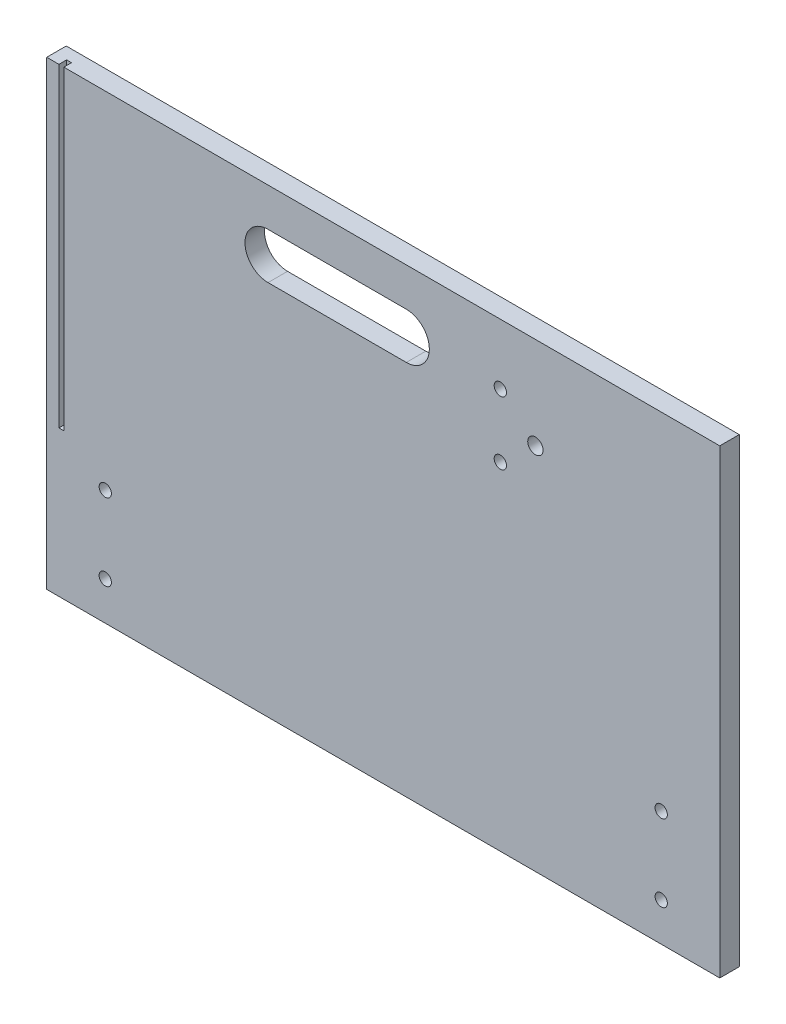
ISO-10303-21;
HEADER;
FILE_DESCRIPTION(('STEP AP214'),'2;1');
FILE_NAME('part.step','',(''),(''),'','','');
FILE_SCHEMA(('AUTOMOTIVE_DESIGN { 1 0 10303 214 1 1 1 1 }'));
ENDSEC;
DATA;
#1=APPLICATION_CONTEXT('core data for automotive mechanical design processes');
#2=APPLICATION_PROTOCOL_DEFINITION('international standard','automotive_design',2000,#1);
#3=PRODUCT_CONTEXT('',#1,'mechanical');
#4=PRODUCT('Part','Part','',(#3));
#5=PRODUCT_RELATED_PRODUCT_CATEGORY('part','',(#4));
#6=PRODUCT_DEFINITION_FORMATION('','',#4);
#7=PRODUCT_DEFINITION_CONTEXT('part definition',#1,'design');
#8=PRODUCT_DEFINITION('design','',#6,#7);
#9=PRODUCT_DEFINITION_SHAPE('','',#8);
#10=(LENGTH_UNIT() NAMED_UNIT(*) SI_UNIT(.MILLI.,.METRE.));
#11=(NAMED_UNIT(*) PLANE_ANGLE_UNIT() SI_UNIT($,.RADIAN.));
#12=(NAMED_UNIT(*) SI_UNIT($,.STERADIAN.) SOLID_ANGLE_UNIT());
#13=UNCERTAINTY_MEASURE_WITH_UNIT(LENGTH_MEASURE(1.E-05),#10,'distance_accuracy_value','');
#14=(GEOMETRIC_REPRESENTATION_CONTEXT(3) GLOBAL_UNCERTAINTY_ASSIGNED_CONTEXT((#13)) GLOBAL_UNIT_ASSIGNED_CONTEXT((#10,
#11,#12)) REPRESENTATION_CONTEXT('',''));
#15=CARTESIAN_POINT('',(0.,0.,0.));
#16=DIRECTION('',(0.,0.,1.));
#17=DIRECTION('',(1.,0.,0.));
#18=AXIS2_PLACEMENT_3D('',#15,#16,#17);
#19=CARTESIAN_POINT('',(0.,0.,12.7));
#20=DIRECTION('',(0.,0.,1.));
#21=DIRECTION('',(1.,0.,0.));
#22=AXIS2_PLACEMENT_3D('',#19,#20,#21);
#23=PLANE('',#22);
#24=CARTESIAN_POINT('',(15.,110.,12.7));
#25=DIRECTION('',(0.,0.,1.));
#26=DIRECTION('',(1.,0.,0.));
#27=AXIS2_PLACEMENT_3D('',#24,#25,#26);
#28=CIRCLE('',#27,15.);
#29=CARTESIAN_POINT('',(15.,95.,12.7));
#30=VERTEX_POINT('',#29);
#31=CARTESIAN_POINT('',(15.,125.,12.7));
#32=VERTEX_POINT('',#31);
#33=EDGE_CURVE('E49',#30,#32,#28,.T.);
#34=ORIENTED_EDGE('',*,*,#33,.F.);
#35=DIRECTION('',(1.,0.,0.));
#36=VECTOR('',#35,1.);
#37=CARTESIAN_POINT('',(15.,95.,12.7));
#38=LINE('',#37,#36);
#39=CARTESIAN_POINT('',(-75.,95.,12.7));
#40=VERTEX_POINT('',#39);
#41=EDGE_CURVE('E130',#40,#30,#38,.T.);
#42=ORIENTED_EDGE('',*,*,#41,.F.);
#43=CARTESIAN_POINT('',(-75.,110.,12.7));
#44=DIRECTION('',(0.,0.,1.));
#45=DIRECTION('',(1.,0.,0.));
#46=AXIS2_PLACEMENT_3D('',#43,#44,#45);
#47=CIRCLE('',#46,15.);
#48=CARTESIAN_POINT('',(-75.,125.,12.7));
#49=VERTEX_POINT('',#48);
#50=EDGE_CURVE('E150',#49,#40,#47,.T.);
#51=ORIENTED_EDGE('',*,*,#50,.F.);
#52=DIRECTION('',(-1.,0.,0.));
#53=VECTOR('',#52,1.);
#54=CARTESIAN_POINT('',(15.,125.,12.7));
#55=LINE('',#54,#53);
#56=EDGE_CURVE('E144',#32,#49,#55,.T.);
#57=ORIENTED_EDGE('',*,*,#56,.F.);
#58=EDGE_LOOP('',(#34,#42,#51,#57));
#59=FACE_BOUND('',#58,.T.);
#60=CARTESIAN_POINT('',(180.95,-75.,12.7));
#61=DIRECTION('',(0.,0.,1.));
#62=DIRECTION('',(-1.,0.,0.));
#63=AXIS2_PLACEMENT_3D('',#60,#61,#62);
#64=CIRCLE('',#63,3.99999999999999);
#65=CARTESIAN_POINT('',(176.95,-75.,12.7));
#66=VERTEX_POINT('',#65);
#67=EDGE_CURVE('E136',#66,#66,#64,.T.);
#68=ORIENTED_EDGE('',*,*,#67,.F.);
#69=EDGE_LOOP('',(#68));
#70=FACE_BOUND('',#69,.T.);
#71=CARTESIAN_POINT('',(180.95,-125.,12.7));
#72=DIRECTION('',(0.,0.,1.));
#73=DIRECTION('',(1.,0.,0.));
#74=AXIS2_PLACEMENT_3D('',#71,#72,#73);
#75=CIRCLE('',#74,3.99999999999999);
#76=CARTESIAN_POINT('',(184.95,-125.,12.7));
#77=VERTEX_POINT('',#76);
#78=EDGE_CURVE('E164',#77,#77,#75,.T.);
#79=ORIENTED_EDGE('',*,*,#78,.F.);
#80=EDGE_LOOP('',(#79));
#81=FACE_BOUND('',#80,.T.);
#82=CARTESIAN_POINT('',(-180.95,-125.,12.7));
#83=DIRECTION('',(0.,0.,1.));
#84=DIRECTION('',(-1.,0.,0.));
#85=AXIS2_PLACEMENT_3D('',#82,#83,#84);
#86=CIRCLE('',#85,3.99999999999999);
#87=CARTESIAN_POINT('',(-184.95,-125.,12.7));
#88=VERTEX_POINT('',#87);
#89=EDGE_CURVE('E170',#88,#88,#86,.T.);
#90=ORIENTED_EDGE('',*,*,#89,.F.);
#91=EDGE_LOOP('',(#90));
#92=FACE_BOUND('',#91,.T.);
#93=CARTESIAN_POINT('',(-180.95,-75.,12.7));
#94=DIRECTION('',(0.,0.,1.));
#95=DIRECTION('',(1.,0.,0.));
#96=AXIS2_PLACEMENT_3D('',#93,#94,#95);
#97=CIRCLE('',#96,3.99999999999999);
#98=CARTESIAN_POINT('',(-176.95,-75.,12.7));
#99=VERTEX_POINT('',#98);
#100=EDGE_CURVE('E176',#99,#99,#97,.T.);
#101=ORIENTED_EDGE('',*,*,#100,.F.);
#102=EDGE_LOOP('',(#101));
#103=FACE_BOUND('',#102,.T.);
#104=DIRECTION('',(0.,-1.,0.));
#105=VECTOR('',#104,1.);
#106=CARTESIAN_POINT('',(-211.1125,150.,12.7));
#107=LINE('',#106,#105);
#108=CARTESIAN_POINT('',(-211.1125,150.,12.7));
#109=VERTEX_POINT('',#108);
#110=CARTESIAN_POINT('',(-211.1125,-55.,12.7));
#111=VERTEX_POINT('',#110);
#112=EDGE_CURVE('E182',#109,#111,#107,.T.);
#113=ORIENTED_EDGE('',*,*,#112,.F.);
#114=DIRECTION('',(-1.,0.,0.));
#115=VECTOR('',#114,1.);
#116=CARTESIAN_POINT('',(0.,150.,12.7));
#117=LINE('',#116,#115);
#118=CARTESIAN_POINT('',(-219.05,150.,12.7));
#119=VERTEX_POINT('',#118);
#120=EDGE_CURVE('E232',#109,#119,#117,.T.);
#121=ORIENTED_EDGE('',*,*,#120,.T.);
#122=DIRECTION('',(0.,-1.,0.));
#123=VECTOR('',#122,1.);
#124=CARTESIAN_POINT('',(-219.05,0.,12.7));
#125=LINE('',#124,#123);
#126=CARTESIAN_POINT('',(-219.05,-150.,12.7));
#127=VERTEX_POINT('',#126);
#128=EDGE_CURVE('E237',#119,#127,#125,.T.);
#129=ORIENTED_EDGE('',*,*,#128,.T.);
#130=DIRECTION('',(-1.,0.,0.));
#131=VECTOR('',#130,1.);
#132=CARTESIAN_POINT('',(0.,-150.,12.7));
#133=LINE('',#132,#131);
#134=CARTESIAN_POINT('',(219.05,-150.,12.7));
#135=VERTEX_POINT('',#134);
#136=EDGE_CURVE('E239',#135,#127,#133,.T.);
#137=ORIENTED_EDGE('',*,*,#136,.F.);
#138=DIRECTION('',(0.,-1.,0.));
#139=VECTOR('',#138,1.);
#140=CARTESIAN_POINT('',(219.05,0.,12.7));
#141=LINE('',#140,#139);
#142=CARTESIAN_POINT('',(219.05,150.,12.7));
#143=VERTEX_POINT('',#142);
#144=EDGE_CURVE('E229',#143,#135,#141,.T.);
#145=ORIENTED_EDGE('',*,*,#144,.F.);
#146=CARTESIAN_POINT('',(-207.9375,150.,12.7));
#147=VERTEX_POINT('',#146);
#148=EDGE_CURVE('E234',#143,#147,#117,.T.);
#149=ORIENTED_EDGE('',*,*,#148,.T.);
#150=DIRECTION('',(0.,1.,0.));
#151=VECTOR('',#150,1.);
#152=CARTESIAN_POINT('',(-207.9375,150.,12.7));
#153=LINE('',#152,#151);
#154=CARTESIAN_POINT('',(-207.9375,-55.,12.7));
#155=VERTEX_POINT('',#154);
#156=EDGE_CURVE('E187',#155,#147,#153,.T.);
#157=ORIENTED_EDGE('',*,*,#156,.F.);
#158=DIRECTION('',(1.,0.,0.));
#159=VECTOR('',#158,1.);
#160=CARTESIAN_POINT('',(-211.1125,-55.,12.7));
#161=LINE('',#160,#159);
#162=EDGE_CURVE('E198',#111,#155,#161,.T.);
#163=ORIENTED_EDGE('',*,*,#162,.F.);
#164=EDGE_LOOP('',(#113,#121,#129,#137,#145,#149,#157,#163));
#165=FACE_BOUND('',#164,.T.);
#166=CARTESIAN_POINT('',(99.0500000000001,90.0000000001999,12.7));
#167=DIRECTION('',(0.,0.,1.));
#168=DIRECTION('',(1.,0.,0.));
#169=AXIS2_PLACEMENT_3D('',#166,#167,#168);
#170=CIRCLE('',#169,5.00000000000001);
#171=CARTESIAN_POINT('',(104.05,90.0000000001999,12.7));
#172=VERTEX_POINT('',#171);
#173=EDGE_CURVE('E204',#172,#172,#170,.T.);
#174=ORIENTED_EDGE('',*,*,#173,.F.);
#175=EDGE_LOOP('',(#174));
#176=FACE_BOUND('',#175,.T.);
#177=CARTESIAN_POINT('',(76.2148703851,110.5900655849,12.7));
#178=DIRECTION('',(0.,0.,1.));
#179=DIRECTION('',(1.,0.,0.));
#180=AXIS2_PLACEMENT_3D('',#177,#178,#179);
#181=CIRCLE('',#180,4.0000000001913);
#182=CARTESIAN_POINT('',(80.2148703852913,110.5900655849,12.7));
#183=VERTEX_POINT('',#182);
#184=EDGE_CURVE('E216',#183,#183,#181,.T.);
#185=ORIENTED_EDGE('',*,*,#184,.F.);
#186=EDGE_LOOP('',(#185));
#187=FACE_BOUND('',#186,.T.);
#188=CARTESIAN_POINT('',(76.2148703851002,69.4099344154998,12.7));
#189=DIRECTION('',(0.,0.,1.));
#190=DIRECTION('',(1.,0.,0.));
#191=AXIS2_PLACEMENT_3D('',#188,#189,#190);
#192=CIRCLE('',#191,4.00000000019125);
#193=CARTESIAN_POINT('',(80.2148703852914,69.4099344154998,12.7));
#194=VERTEX_POINT('',#193);
#195=EDGE_CURVE('E223',#194,#194,#192,.F.);
#196=ORIENTED_EDGE('',*,*,#195,.T.);
#197=EDGE_LOOP('',(#196));
#198=FACE_BOUND('',#197,.T.);
#199=ADVANCED_FACE('F34',(#59,#70,#81,#92,#103,#165,#176,#187,#198),#23,.T.);
#200=CARTESIAN_POINT('',(0.,0.,0.));
#201=DIRECTION('',(0.,0.,1.));
#202=DIRECTION('',(1.,0.,0.));
#203=AXIS2_PLACEMENT_3D('',#200,#201,#202);
#204=PLANE('',#203);
#205=DIRECTION('',(-1.,0.,0.));
#206=VECTOR('',#205,1.);
#207=CARTESIAN_POINT('',(15.,95.,0.));
#208=LINE('',#207,#206);
#209=CARTESIAN_POINT('',(15.,95.,0.));
#210=VERTEX_POINT('',#209);
#211=CARTESIAN_POINT('',(-75.,95.,0.));
#212=VERTEX_POINT('',#211);
#213=EDGE_CURVE('E142',#210,#212,#208,.T.);
#214=ORIENTED_EDGE('',*,*,#213,.F.);
#215=CARTESIAN_POINT('',(15.,110.,0.));
#216=DIRECTION('',(0.,0.,1.));
#217=DIRECTION('',(1.,0.,0.));
#218=AXIS2_PLACEMENT_3D('',#215,#216,#217);
#219=CIRCLE('',#218,15.);
#220=CARTESIAN_POINT('',(15.,125.,0.));
#221=VERTEX_POINT('',#220);
#222=EDGE_CURVE('E124',#221,#210,#219,.F.);
#223=ORIENTED_EDGE('',*,*,#222,.F.);
#224=DIRECTION('',(1.,0.,0.));
#225=VECTOR('',#224,1.);
#226=CARTESIAN_POINT('',(15.,125.,0.));
#227=LINE('',#226,#225);
#228=CARTESIAN_POINT('',(-75.,125.,0.));
#229=VERTEX_POINT('',#228);
#230=EDGE_CURVE('E133',#229,#221,#227,.T.);
#231=ORIENTED_EDGE('',*,*,#230,.F.);
#232=CARTESIAN_POINT('',(-75.,110.,0.));
#233=DIRECTION('',(0.,0.,1.));
#234=DIRECTION('',(1.,0.,0.));
#235=AXIS2_PLACEMENT_3D('',#232,#233,#234);
#236=CIRCLE('',#235,15.);
#237=EDGE_CURVE('E57',#212,#229,#236,.F.);
#238=ORIENTED_EDGE('',*,*,#237,.F.);
#239=EDGE_LOOP('',(#214,#223,#231,#238));
#240=FACE_BOUND('',#239,.T.);
#241=CARTESIAN_POINT('',(180.95,-75.,0.));
#242=DIRECTION('',(0.,0.,1.));
#243=DIRECTION('',(1.,0.,0.));
#244=AXIS2_PLACEMENT_3D('',#241,#242,#243);
#245=CIRCLE('',#244,3.99999999999999);
#246=CARTESIAN_POINT('',(184.95,-75.,0.));
#247=VERTEX_POINT('',#246);
#248=EDGE_CURVE('E161',#247,#247,#245,.F.);
#249=ORIENTED_EDGE('',*,*,#248,.F.);
#250=EDGE_LOOP('',(#249));
#251=FACE_BOUND('',#250,.T.);
#252=CARTESIAN_POINT('',(180.95,-125.,0.));
#253=DIRECTION('',(0.,0.,1.));
#254=DIRECTION('',(1.,0.,0.));
#255=AXIS2_PLACEMENT_3D('',#252,#253,#254);
#256=CIRCLE('',#255,3.99999999999999);
#257=CARTESIAN_POINT('',(184.95,-125.,0.));
#258=VERTEX_POINT('',#257);
#259=EDGE_CURVE('E167',#258,#258,#256,.F.);
#260=ORIENTED_EDGE('',*,*,#259,.F.);
#261=EDGE_LOOP('',(#260));
#262=FACE_BOUND('',#261,.T.);
#263=CARTESIAN_POINT('',(-180.95,-125.,0.));
#264=DIRECTION('',(0.,0.,1.));
#265=DIRECTION('',(1.,0.,0.));
#266=AXIS2_PLACEMENT_3D('',#263,#264,#265);
#267=CIRCLE('',#266,3.99999999999999);
#268=CARTESIAN_POINT('',(-176.95,-125.,0.));
#269=VERTEX_POINT('',#268);
#270=EDGE_CURVE('E173',#269,#269,#267,.F.);
#271=ORIENTED_EDGE('',*,*,#270,.F.);
#272=EDGE_LOOP('',(#271));
#273=FACE_BOUND('',#272,.T.);
#274=CARTESIAN_POINT('',(-180.95,-75.,0.));
#275=DIRECTION('',(0.,0.,1.));
#276=DIRECTION('',(1.,0.,0.));
#277=AXIS2_PLACEMENT_3D('',#274,#275,#276);
#278=CIRCLE('',#277,3.99999999999999);
#279=CARTESIAN_POINT('',(-176.95,-75.,0.));
#280=VERTEX_POINT('',#279);
#281=EDGE_CURVE('E179',#280,#280,#278,.F.);
#282=ORIENTED_EDGE('',*,*,#281,.F.);
#283=EDGE_LOOP('',(#282));
#284=FACE_BOUND('',#283,.T.);
#285=CARTESIAN_POINT('',(99.0500000000001,90.0000000001999,0.));
#286=DIRECTION('',(0.,0.,1.));
#287=DIRECTION('',(1.,0.,0.));
#288=AXIS2_PLACEMENT_3D('',#285,#286,#287);
#289=CIRCLE('',#288,5.00000000000001);
#290=CARTESIAN_POINT('',(104.05,90.0000000001999,0.));
#291=VERTEX_POINT('',#290);
#292=EDGE_CURVE('E213',#291,#291,#289,.F.);
#293=ORIENTED_EDGE('',*,*,#292,.F.);
#294=EDGE_LOOP('',(#293));
#295=FACE_BOUND('',#294,.T.);
#296=CARTESIAN_POINT('',(76.2148703851,110.5900655849,0.));
#297=DIRECTION('',(0.,0.,1.));
#298=DIRECTION('',(1.,0.,0.));
#299=AXIS2_PLACEMENT_3D('',#296,#297,#298);
#300=CIRCLE('',#299,4.0000000001913);
#301=CARTESIAN_POINT('',(80.2148703852913,110.5900655849,0.));
#302=VERTEX_POINT('',#301);
#303=EDGE_CURVE('E219',#302,#302,#300,.F.);
#304=ORIENTED_EDGE('',*,*,#303,.F.);
#305=EDGE_LOOP('',(#304));
#306=FACE_BOUND('',#305,.T.);
#307=DIRECTION('',(0.,-1.,0.));
#308=VECTOR('',#307,1.);
#309=CARTESIAN_POINT('',(219.05,0.,0.));
#310=LINE('',#309,#308);
#311=CARTESIAN_POINT('',(219.05,150.,0.));
#312=VERTEX_POINT('',#311);
#313=CARTESIAN_POINT('',(219.05,-150.,0.));
#314=VERTEX_POINT('',#313);
#315=EDGE_CURVE('E226',#312,#314,#310,.T.);
#316=ORIENTED_EDGE('',*,*,#315,.T.);
#317=DIRECTION('',(-1.,0.,0.));
#318=VECTOR('',#317,1.);
#319=CARTESIAN_POINT('',(0.,-150.,0.));
#320=LINE('',#319,#318);
#321=CARTESIAN_POINT('',(-219.05,-150.,0.));
#322=VERTEX_POINT('',#321);
#323=EDGE_CURVE('E233',#314,#322,#320,.T.);
#324=ORIENTED_EDGE('',*,*,#323,.T.);
#325=DIRECTION('',(0.,-1.,0.));
#326=VECTOR('',#325,1.);
#327=CARTESIAN_POINT('',(-219.05,0.,0.));
#328=LINE('',#327,#326);
#329=CARTESIAN_POINT('',(-219.05,150.,0.));
#330=VERTEX_POINT('',#329);
#331=EDGE_CURVE('E247',#330,#322,#328,.T.);
#332=ORIENTED_EDGE('',*,*,#331,.F.);
#333=DIRECTION('',(-1.,0.,0.));
#334=VECTOR('',#333,1.);
#335=CARTESIAN_POINT('',(0.,150.,0.));
#336=LINE('',#335,#334);
#337=EDGE_CURVE('E245',#312,#330,#336,.T.);
#338=ORIENTED_EDGE('',*,*,#337,.F.);
#339=EDGE_LOOP('',(#316,#324,#332,#338));
#340=FACE_BOUND('',#339,.T.);
#341=CARTESIAN_POINT('',(76.2148703851002,69.4099344154998,0.));
#342=DIRECTION('',(0.,0.,1.));
#343=DIRECTION('',(1.,0.,0.));
#344=AXIS2_PLACEMENT_3D('',#341,#342,#343);
#345=CIRCLE('',#344,4.00000000019125);
#346=CARTESIAN_POINT('',(80.2148703852914,69.4099344154998,0.));
#347=VERTEX_POINT('',#346);
#348=EDGE_CURVE('E222',#347,#347,#345,.T.);
#349=ORIENTED_EDGE('',*,*,#348,.T.);
#350=EDGE_LOOP('',(#349));
#351=FACE_BOUND('',#350,.T.);
#352=ADVANCED_FACE('F139',(#240,#251,#262,#273,#284,#295,#306,#340,#351),#204,.F.);
#353=CARTESIAN_POINT('',(219.05,0.,12.7));
#354=DIRECTION('',(1.,0.,0.));
#355=DIRECTION('',(0.,0.,-1.));
#356=AXIS2_PLACEMENT_3D('',#353,#354,#355);
#357=PLANE('',#356);
#358=ORIENTED_EDGE('',*,*,#315,.F.);
#359=DIRECTION('',(0.,0.,-1.));
#360=VECTOR('',#359,1.);
#361=CARTESIAN_POINT('',(219.05,150.,12.7));
#362=LINE('',#361,#360);
#363=EDGE_CURVE('E11',#143,#312,#362,.T.);
#364=ORIENTED_EDGE('',*,*,#363,.F.);
#365=ORIENTED_EDGE('',*,*,#144,.T.);
#366=DIRECTION('',(0.,0.,-1.));
#367=VECTOR('',#366,1.);
#368=CARTESIAN_POINT('',(219.05,-150.,12.7));
#369=LINE('',#368,#367);
#370=EDGE_CURVE('E242',#135,#314,#369,.T.);
#371=ORIENTED_EDGE('',*,*,#370,.T.);
#372=EDGE_LOOP('',(#358,#364,#365,#371));
#373=FACE_BOUND('',#372,.T.);
#374=ADVANCED_FACE('F36',(#373),#357,.T.);
#375=CARTESIAN_POINT('',(0.,150.,12.7));
#376=DIRECTION('',(0.,-1.,0.));
#377=DIRECTION('',(1.,0.,0.));
#378=AXIS2_PLACEMENT_3D('',#375,#376,#377);
#379=PLANE('',#378);
#380=ORIENTED_EDGE('',*,*,#120,.F.);
#381=DIRECTION('',(0.,0.,1.));
#382=VECTOR('',#381,1.);
#383=CARTESIAN_POINT('',(-211.1125,150.,7.7));
#384=LINE('',#383,#382);
#385=CARTESIAN_POINT('',(-211.1125,150.,7.7));
#386=VERTEX_POINT('',#385);
#387=EDGE_CURVE('E202',#386,#109,#384,.T.);
#388=ORIENTED_EDGE('',*,*,#387,.F.);
#389=DIRECTION('',(-1.,0.,0.));
#390=VECTOR('',#389,1.);
#391=CARTESIAN_POINT('',(-211.1125,150.,7.7));
#392=LINE('',#391,#390);
#393=CARTESIAN_POINT('',(-207.9375,150.,7.7));
#394=VERTEX_POINT('',#393);
#395=EDGE_CURVE('E192',#394,#386,#392,.T.);
#396=ORIENTED_EDGE('',*,*,#395,.F.);
#397=DIRECTION('',(0.,0.,1.));
#398=VECTOR('',#397,1.);
#399=CARTESIAN_POINT('',(-207.9375,150.,7.7));
#400=LINE('',#399,#398);
#401=EDGE_CURVE('E205',#394,#147,#400,.T.);
#402=ORIENTED_EDGE('',*,*,#401,.T.);
#403=ORIENTED_EDGE('',*,*,#148,.F.);
#404=ORIENTED_EDGE('',*,*,#363,.T.);
#405=ORIENTED_EDGE('',*,*,#337,.T.);
#406=DIRECTION('',(0.,0.,-1.));
#407=VECTOR('',#406,1.);
#408=CARTESIAN_POINT('',(-219.05,150.,12.7));
#409=LINE('',#408,#407);
#410=EDGE_CURVE('E42',#119,#330,#409,.T.);
#411=ORIENTED_EDGE('',*,*,#410,.F.);
#412=EDGE_LOOP('',(#380,#388,#396,#402,#403,#404,#405,#411));
#413=FACE_BOUND('',#412,.T.);
#414=ADVANCED_FACE('F277',(#413),#379,.F.);
#415=CARTESIAN_POINT('',(-219.05,0.,12.7));
#416=DIRECTION('',(1.,0.,0.));
#417=DIRECTION('',(0.,1.,0.));
#418=AXIS2_PLACEMENT_3D('',#415,#416,#417);
#419=PLANE('',#418);
#420=ORIENTED_EDGE('',*,*,#331,.T.);
#421=DIRECTION('',(0.,0.,-1.));
#422=VECTOR('',#421,1.);
#423=CARTESIAN_POINT('',(-219.05,-150.,12.7));
#424=LINE('',#423,#422);
#425=EDGE_CURVE('E253',#127,#322,#424,.T.);
#426=ORIENTED_EDGE('',*,*,#425,.F.);
#427=ORIENTED_EDGE('',*,*,#128,.F.);
#428=ORIENTED_EDGE('',*,*,#410,.T.);
#429=EDGE_LOOP('',(#420,#426,#427,#428));
#430=FACE_BOUND('',#429,.T.);
#431=ADVANCED_FACE('F259',(#430),#419,.F.);
#432=CARTESIAN_POINT('',(0.,-150.,12.7));
#433=DIRECTION('',(0.,-1.,0.));
#434=DIRECTION('',(1.,0.,0.));
#435=AXIS2_PLACEMENT_3D('',#432,#433,#434);
#436=PLANE('',#435);
#437=ORIENTED_EDGE('',*,*,#323,.F.);
#438=ORIENTED_EDGE('',*,*,#370,.F.);
#439=ORIENTED_EDGE('',*,*,#136,.T.);
#440=ORIENTED_EDGE('',*,*,#425,.T.);
#441=EDGE_LOOP('',(#437,#438,#439,#440));
#442=FACE_BOUND('',#441,.T.);
#443=ADVANCED_FACE('F269',(#442),#436,.T.);
#444=CARTESIAN_POINT('',(76.2148703851002,69.4099344154998,-0.000999999999999265));
#445=DIRECTION('',(0.,0.,1.));
#446=DIRECTION('',(1.,0.,0.));
#447=AXIS2_PLACEMENT_3D('',#444,#445,#446);
#448=CYLINDRICAL_SURFACE('',#447,4.00000000019125);
#449=ORIENTED_EDGE('',*,*,#195,.F.);
#450=EDGE_LOOP('',(#449));
#451=FACE_BOUND('',#450,.T.);
#452=ORIENTED_EDGE('',*,*,#348,.F.);
#453=EDGE_LOOP('',(#452));
#454=FACE_BOUND('',#453,.T.);
#455=ADVANCED_FACE('F311',(#451,#454),#448,.F.);
#456=CARTESIAN_POINT('',(76.2148703851,110.5900655849,-0.000999999999999265));
#457=DIRECTION('',(0.,0.,1.));
#458=DIRECTION('',(1.,0.,0.));
#459=AXIS2_PLACEMENT_3D('',#456,#457,#458);
#460=CYLINDRICAL_SURFACE('',#459,4.0000000001913);
#461=ORIENTED_EDGE('',*,*,#184,.T.);
#462=EDGE_LOOP('',(#461));
#463=FACE_BOUND('',#462,.T.);
#464=ORIENTED_EDGE('',*,*,#303,.T.);
#465=EDGE_LOOP('',(#464));
#466=FACE_BOUND('',#465,.T.);
#467=ADVANCED_FACE('F399',(#463,#466),#460,.F.);
#468=CARTESIAN_POINT('',(99.0500000000001,90.0000000001999,-0.000999999999999265));
#469=DIRECTION('',(0.,0.,1.));
#470=DIRECTION('',(1.,0.,0.));
#471=AXIS2_PLACEMENT_3D('',#468,#469,#470);
#472=CYLINDRICAL_SURFACE('',#471,5.00000000000001);
#473=ORIENTED_EDGE('',*,*,#173,.T.);
#474=EDGE_LOOP('',(#473));
#475=FACE_BOUND('',#474,.T.);
#476=ORIENTED_EDGE('',*,*,#292,.T.);
#477=EDGE_LOOP('',(#476));
#478=FACE_BOUND('',#477,.T.);
#479=ADVANCED_FACE('F401',(#475,#478),#472,.F.);
#480=CARTESIAN_POINT('',(-211.1125,150.,7.7));
#481=DIRECTION('',(-1.,0.,0.));
#482=DIRECTION('',(0.,-1.,0.));
#483=AXIS2_PLACEMENT_3D('',#480,#481,#482);
#484=PLANE('',#483);
#485=ORIENTED_EDGE('',*,*,#112,.T.);
#486=DIRECTION('',(0.,0.,1.));
#487=VECTOR('',#486,1.);
#488=CARTESIAN_POINT('',(-211.1125,-55.,7.7));
#489=LINE('',#488,#487);
#490=CARTESIAN_POINT('',(-211.1125,-55.,7.7));
#491=VERTEX_POINT('',#490);
#492=EDGE_CURVE('E195',#491,#111,#489,.T.);
#493=ORIENTED_EDGE('',*,*,#492,.F.);
#494=DIRECTION('',(0.,-1.,0.));
#495=VECTOR('',#494,1.);
#496=CARTESIAN_POINT('',(-211.1125,150.,7.7));
#497=LINE('',#496,#495);
#498=EDGE_CURVE('E183',#386,#491,#497,.T.);
#499=ORIENTED_EDGE('',*,*,#498,.F.);
#500=ORIENTED_EDGE('',*,*,#387,.T.);
#501=EDGE_LOOP('',(#485,#493,#499,#500));
#502=FACE_BOUND('',#501,.T.);
#503=ADVANCED_FACE('F280',(#502),#484,.F.);
#504=CARTESIAN_POINT('',(-207.9375,150.,7.7));
#505=DIRECTION('',(1.,0.,0.));
#506=DIRECTION('',(0.,1.,0.));
#507=AXIS2_PLACEMENT_3D('',#504,#505,#506);
#508=PLANE('',#507);
#509=ORIENTED_EDGE('',*,*,#156,.T.);
#510=ORIENTED_EDGE('',*,*,#401,.F.);
#511=DIRECTION('',(0.,1.,0.));
#512=VECTOR('',#511,1.);
#513=CARTESIAN_POINT('',(-207.9375,150.,7.7));
#514=LINE('',#513,#512);
#515=CARTESIAN_POINT('',(-207.9375,-55.,7.7));
#516=VERTEX_POINT('',#515);
#517=EDGE_CURVE('E190',#516,#394,#514,.T.);
#518=ORIENTED_EDGE('',*,*,#517,.F.);
#519=DIRECTION('',(0.,0.,1.));
#520=VECTOR('',#519,1.);
#521=CARTESIAN_POINT('',(-207.9375,-55.,7.7));
#522=LINE('',#521,#520);
#523=EDGE_CURVE('E208',#516,#155,#522,.T.);
#524=ORIENTED_EDGE('',*,*,#523,.T.);
#525=EDGE_LOOP('',(#509,#510,#518,#524));
#526=FACE_BOUND('',#525,.T.);
#527=ADVANCED_FACE('F287',(#526),#508,.F.);
#528=CARTESIAN_POINT('',(-211.1125,-55.,7.7));
#529=DIRECTION('',(0.,-1.,0.));
#530=DIRECTION('',(0.,0.,-1.));
#531=AXIS2_PLACEMENT_3D('',#528,#529,#530);
#532=PLANE('',#531);
#533=ORIENTED_EDGE('',*,*,#162,.T.);
#534=ORIENTED_EDGE('',*,*,#523,.F.);
#535=DIRECTION('',(1.,0.,0.));
#536=VECTOR('',#535,1.);
#537=CARTESIAN_POINT('',(-211.1125,-55.,7.7));
#538=LINE('',#537,#536);
#539=EDGE_CURVE('E186',#491,#516,#538,.T.);
#540=ORIENTED_EDGE('',*,*,#539,.F.);
#541=ORIENTED_EDGE('',*,*,#492,.T.);
#542=EDGE_LOOP('',(#533,#534,#540,#541));
#543=FACE_BOUND('',#542,.T.);
#544=ADVANCED_FACE('F291',(#543),#532,.F.);
#545=CARTESIAN_POINT('',(0.,0.,7.7));
#546=DIRECTION('',(0.,0.,1.));
#547=DIRECTION('',(1.,0.,0.));
#548=AXIS2_PLACEMENT_3D('',#545,#546,#547);
#549=PLANE('',#548);
#550=ORIENTED_EDGE('',*,*,#498,.T.);
#551=ORIENTED_EDGE('',*,*,#539,.T.);
#552=ORIENTED_EDGE('',*,*,#517,.T.);
#553=ORIENTED_EDGE('',*,*,#395,.T.);
#554=EDGE_LOOP('',(#550,#551,#552,#553));
#555=FACE_BOUND('',#554,.T.);
#556=ADVANCED_FACE('F283',(#555),#549,.T.);
#557=CARTESIAN_POINT('',(-180.95,-75.,-0.000999999999999265));
#558=DIRECTION('',(0.,0.,1.));
#559=DIRECTION('',(1.,0.,0.));
#560=AXIS2_PLACEMENT_3D('',#557,#558,#559);
#561=CYLINDRICAL_SURFACE('',#560,3.99999999999999);
#562=ORIENTED_EDGE('',*,*,#100,.T.);
#563=EDGE_LOOP('',(#562));
#564=FACE_BOUND('',#563,.T.);
#565=ORIENTED_EDGE('',*,*,#281,.T.);
#566=EDGE_LOOP('',(#565));
#567=FACE_BOUND('',#566,.T.);
#568=ADVANCED_FACE('F298',(#564,#567),#561,.F.);
#569=CARTESIAN_POINT('',(-180.95,-125.,-0.000999999999999265));
#570=DIRECTION('',(0.,0.,1.));
#571=DIRECTION('',(1.,0.,0.));
#572=AXIS2_PLACEMENT_3D('',#569,#570,#571);
#573=CYLINDRICAL_SURFACE('',#572,3.99999999999999);
#574=ORIENTED_EDGE('',*,*,#89,.T.);
#575=EDGE_LOOP('',(#574));
#576=FACE_BOUND('',#575,.T.);
#577=ORIENTED_EDGE('',*,*,#270,.T.);
#578=EDGE_LOOP('',(#577));
#579=FACE_BOUND('',#578,.T.);
#580=ADVANCED_FACE('F381',(#576,#579),#573,.F.);
#581=CARTESIAN_POINT('',(180.95,-125.,-0.000999999999999265));
#582=DIRECTION('',(0.,0.,1.));
#583=DIRECTION('',(1.,0.,0.));
#584=AXIS2_PLACEMENT_3D('',#581,#582,#583);
#585=CYLINDRICAL_SURFACE('',#584,3.99999999999999);
#586=ORIENTED_EDGE('',*,*,#78,.T.);
#587=EDGE_LOOP('',(#586));
#588=FACE_BOUND('',#587,.T.);
#589=ORIENTED_EDGE('',*,*,#259,.T.);
#590=EDGE_LOOP('',(#589));
#591=FACE_BOUND('',#590,.T.);
#592=ADVANCED_FACE('F377',(#588,#591),#585,.F.);
#593=CARTESIAN_POINT('',(180.95,-75.,-0.000999999999999265));
#594=DIRECTION('',(0.,0.,1.));
#595=DIRECTION('',(1.,0.,0.));
#596=AXIS2_PLACEMENT_3D('',#593,#594,#595);
#597=CYLINDRICAL_SURFACE('',#596,3.99999999999999);
#598=ORIENTED_EDGE('',*,*,#67,.T.);
#599=EDGE_LOOP('',(#598));
#600=FACE_BOUND('',#599,.T.);
#601=ORIENTED_EDGE('',*,*,#248,.T.);
#602=EDGE_LOOP('',(#601));
#603=FACE_BOUND('',#602,.T.);
#604=ADVANCED_FACE('F343',(#600,#603),#597,.F.);
#605=CARTESIAN_POINT('',(15.,110.,-0.000999999999999265));
#606=DIRECTION('',(0.,0.,1.));
#607=DIRECTION('',(1.,0.,0.));
#608=AXIS2_PLACEMENT_3D('',#605,#606,#607);
#609=CYLINDRICAL_SURFACE('',#608,15.);
#610=ORIENTED_EDGE('',*,*,#222,.T.);
#611=DIRECTION('',(0.,0.,1.));
#612=VECTOR('',#611,1.);
#613=CARTESIAN_POINT('',(15.,95.,-0.000999999999999265));
#614=LINE('',#613,#612);
#615=EDGE_CURVE('E137',#210,#30,#614,.T.);
#616=ORIENTED_EDGE('',*,*,#615,.T.);
#617=ORIENTED_EDGE('',*,*,#33,.T.);
#618=DIRECTION('',(0.,0.,1.));
#619=VECTOR('',#618,1.);
#620=CARTESIAN_POINT('',(15.,125.,-0.000999999999999265));
#621=LINE('',#620,#619);
#622=EDGE_CURVE('E120',#221,#32,#621,.T.);
#623=ORIENTED_EDGE('',*,*,#622,.F.);
#624=EDGE_LOOP('',(#610,#616,#617,#623));
#625=FACE_BOUND('',#624,.T.);
#626=ADVANCED_FACE('F122',(#625),#609,.F.);
#627=CARTESIAN_POINT('',(15.,95.,-0.000999999999999265));
#628=DIRECTION('',(0.,-1.,0.));
#629=DIRECTION('',(1.,0.,0.));
#630=AXIS2_PLACEMENT_3D('',#627,#628,#629);
#631=PLANE('',#630);
#632=ORIENTED_EDGE('',*,*,#213,.T.);
#633=DIRECTION('',(0.,0.,1.));
#634=VECTOR('',#633,1.);
#635=CARTESIAN_POINT('',(-75.,95.,-0.000999999999999265));
#636=LINE('',#635,#634);
#637=EDGE_CURVE('E156',#212,#40,#636,.T.);
#638=ORIENTED_EDGE('',*,*,#637,.T.);
#639=ORIENTED_EDGE('',*,*,#41,.T.);
#640=ORIENTED_EDGE('',*,*,#615,.F.);
#641=EDGE_LOOP('',(#632,#638,#639,#640));
#642=FACE_BOUND('',#641,.T.);
#643=ADVANCED_FACE('F342',(#642),#631,.F.);
#644=CARTESIAN_POINT('',(-75.,110.,-0.000999999999999265));
#645=DIRECTION('',(0.,0.,1.));
#646=DIRECTION('',(1.,0.,0.));
#647=AXIS2_PLACEMENT_3D('',#644,#645,#646);
#648=CYLINDRICAL_SURFACE('',#647,15.);
#649=ORIENTED_EDGE('',*,*,#237,.T.);
#650=DIRECTION('',(0.,0.,1.));
#651=VECTOR('',#650,1.);
#652=CARTESIAN_POINT('',(-75.,125.,-0.000999999999999265));
#653=LINE('',#652,#651);
#654=EDGE_CURVE('E129',#229,#49,#653,.T.);
#655=ORIENTED_EDGE('',*,*,#654,.T.);
#656=ORIENTED_EDGE('',*,*,#50,.T.);
#657=ORIENTED_EDGE('',*,*,#637,.F.);
#658=EDGE_LOOP('',(#649,#655,#656,#657));
#659=FACE_BOUND('',#658,.T.);
#660=ADVANCED_FACE('F354',(#659),#648,.F.);
#661=CARTESIAN_POINT('',(15.,125.,-0.000999999999999265));
#662=DIRECTION('',(0.,1.,0.));
#663=DIRECTION('',(0.,0.,1.));
#664=AXIS2_PLACEMENT_3D('',#661,#662,#663);
#665=PLANE('',#664);
#666=ORIENTED_EDGE('',*,*,#230,.T.);
#667=ORIENTED_EDGE('',*,*,#622,.T.);
#668=ORIENTED_EDGE('',*,*,#56,.T.);
#669=ORIENTED_EDGE('',*,*,#654,.F.);
#670=EDGE_LOOP('',(#666,#667,#668,#669));
#671=FACE_BOUND('',#670,.T.);
#672=ADVANCED_FACE('F134',(#671),#665,.F.);
#673=CLOSED_SHELL('',(#199,#352,#374,#414,#431,#443,#455,#467,#479,#503,#527,#544,#556,#568,
#580,#592,#604,#626,#643,#660,#672));
#674=MANIFOLD_SOLID_BREP('B2',#673);
#675=ADVANCED_BREP_SHAPE_REPRESENTATION('',(#18,#674),#14);
#676=SHAPE_DEFINITION_REPRESENTATION(#9,#675);
ENDSEC;
END-ISO-10303-21;
